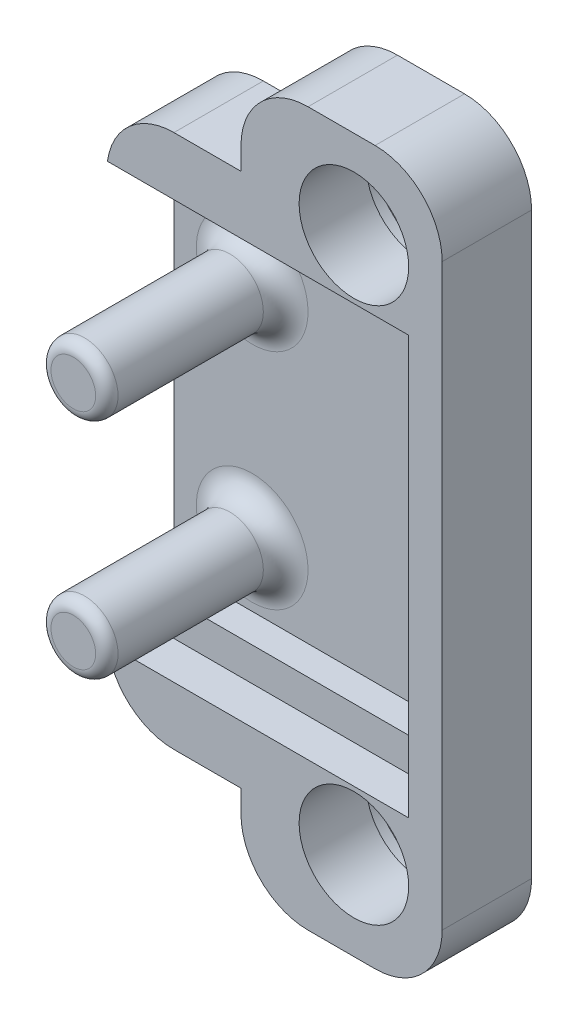
ISO-10303-21;
HEADER;
FILE_DESCRIPTION(('STEP AP214'),'2;1');
FILE_NAME('part.step','',(''),(''),'','','');
FILE_SCHEMA(('AUTOMOTIVE_DESIGN { 1 0 10303 214 1 1 1 1 }'));
ENDSEC;
DATA;
#1=APPLICATION_CONTEXT('core data for automotive mechanical design processes');
#2=APPLICATION_PROTOCOL_DEFINITION('international standard','automotive_design',2000,#1);
#3=PRODUCT_CONTEXT('',#1,'mechanical');
#4=PRODUCT('Part','Part','',(#3));
#5=PRODUCT_RELATED_PRODUCT_CATEGORY('part','',(#4));
#6=PRODUCT_DEFINITION_FORMATION('','',#4);
#7=PRODUCT_DEFINITION_CONTEXT('part definition',#1,'design');
#8=PRODUCT_DEFINITION('design','',#6,#7);
#9=PRODUCT_DEFINITION_SHAPE('','',#8);
#10=(LENGTH_UNIT() NAMED_UNIT(*) SI_UNIT(.MILLI.,.METRE.));
#11=(NAMED_UNIT(*) PLANE_ANGLE_UNIT() SI_UNIT($,.RADIAN.));
#12=(NAMED_UNIT(*) SI_UNIT($,.STERADIAN.) SOLID_ANGLE_UNIT());
#13=UNCERTAINTY_MEASURE_WITH_UNIT(LENGTH_MEASURE(1.E-05),#10,'distance_accuracy_value','');
#14=(GEOMETRIC_REPRESENTATION_CONTEXT(3) GLOBAL_UNCERTAINTY_ASSIGNED_CONTEXT((#13)) GLOBAL_UNIT_ASSIGNED_CONTEXT((#10,
#11,#12)) REPRESENTATION_CONTEXT('',''));
#15=CARTESIAN_POINT('',(0.,0.,0.));
#16=DIRECTION('',(0.,0.,1.));
#17=DIRECTION('',(1.,0.,0.));
#18=AXIS2_PLACEMENT_3D('',#15,#16,#17);
#19=CARTESIAN_POINT('',(6.29041095890411,-12.,4.));
#20=DIRECTION('',(0.,0.,-1.));
#21=DIRECTION('',(-1.,0.,0.));
#22=AXIS2_PLACEMENT_3D('',#19,#20,#21);
#23=CYLINDRICAL_SURFACE('',#22,2.45);
#24=CARTESIAN_POINT('',(6.29041095890411,-12.,4.));
#25=DIRECTION('',(0.,0.,1.));
#26=DIRECTION('',(1.,0.,0.));
#27=AXIS2_PLACEMENT_3D('',#24,#25,#26);
#28=CIRCLE('',#27,2.45);
#29=CARTESIAN_POINT('',(8.74041095890411,-12.,4.));
#30=VERTEX_POINT('',#29);
#31=EDGE_CURVE('E315',#30,#30,#28,.T.);
#32=ORIENTED_EDGE('',*,*,#31,.T.);
#33=EDGE_LOOP('',(#32));
#34=FACE_BOUND('',#33,.T.);
#35=CARTESIAN_POINT('',(6.29041095890411,-12.,1.));
#36=DIRECTION('',(0.,0.,-1.));
#37=DIRECTION('',(-1.,0.,0.));
#38=AXIS2_PLACEMENT_3D('',#35,#36,#37);
#39=CIRCLE('',#38,2.45);
#40=CARTESIAN_POINT('',(3.84041095890411,-12.,1.));
#41=VERTEX_POINT('',#40);
#42=EDGE_CURVE('E67',#41,#41,#39,.T.);
#43=ORIENTED_EDGE('',*,*,#42,.T.);
#44=EDGE_LOOP('',(#43));
#45=FACE_BOUND('',#44,.T.);
#46=ADVANCED_FACE('F63',(#34,#45),#23,.F.);
#47=CARTESIAN_POINT('',(6.29041095890411,12.,4.));
#48=DIRECTION('',(0.,0.,-1.));
#49=DIRECTION('',(-1.,0.,0.));
#50=AXIS2_PLACEMENT_3D('',#47,#48,#49);
#51=CYLINDRICAL_SURFACE('',#50,2.45);
#52=CARTESIAN_POINT('',(6.29041095890411,12.,4.));
#53=DIRECTION('',(0.,0.,1.));
#54=DIRECTION('',(1.,0.,0.));
#55=AXIS2_PLACEMENT_3D('',#52,#53,#54);
#56=CIRCLE('',#55,2.45);
#57=CARTESIAN_POINT('',(8.74041095890411,12.,4.));
#58=VERTEX_POINT('',#57);
#59=EDGE_CURVE('E312',#58,#58,#56,.T.);
#60=ORIENTED_EDGE('',*,*,#59,.T.);
#61=EDGE_LOOP('',(#60));
#62=FACE_BOUND('',#61,.T.);
#63=CARTESIAN_POINT('',(6.29041095890411,12.,1.));
#64=DIRECTION('',(0.,0.,-1.));
#65=DIRECTION('',(-1.,0.,0.));
#66=AXIS2_PLACEMENT_3D('',#63,#64,#65);
#67=CIRCLE('',#66,2.45);
#68=CARTESIAN_POINT('',(3.84041095890411,12.,1.));
#69=VERTEX_POINT('',#68);
#70=EDGE_CURVE('E413',#69,#69,#67,.T.);
#71=ORIENTED_EDGE('',*,*,#70,.T.);
#72=EDGE_LOOP('',(#71));
#73=FACE_BOUND('',#72,.T.);
#74=ADVANCED_FACE('F524',(#62,#73),#51,.F.);
#75=CARTESIAN_POINT('',(0.,0.,4.));
#76=DIRECTION('',(0.,0.,1.));
#77=DIRECTION('',(1.,0.,0.));
#78=AXIS2_PLACEMENT_3D('',#75,#76,#77);
#79=PLANE('',#78);
#80=ORIENTED_EDGE('',*,*,#59,.F.);
#81=EDGE_LOOP('',(#80));
#82=FACE_BOUND('',#81,.T.);
#83=ORIENTED_EDGE('',*,*,#31,.F.);
#84=EDGE_LOOP('',(#83));
#85=FACE_BOUND('',#84,.T.);
#86=DIRECTION('',(0.,-1.,0.));
#87=VECTOR('',#86,1.);
#88=CARTESIAN_POINT('',(10.2404109589041,0.,4.));
#89=LINE('',#88,#87);
#90=CARTESIAN_POINT('',(10.2404109589041,12.95,4.));
#91=VERTEX_POINT('',#90);
#92=CARTESIAN_POINT('',(10.2404109589041,-12.95,4.));
#93=VERTEX_POINT('',#92);
#94=EDGE_CURVE('E325',#91,#93,#89,.T.);
#95=ORIENTED_EDGE('',*,*,#94,.F.);
#96=CARTESIAN_POINT('',(7.24041095890411,12.95,4.));
#97=DIRECTION('',(0.,0.,1.));
#98=DIRECTION('',(1.,0.,0.));
#99=AXIS2_PLACEMENT_3D('',#96,#97,#98);
#100=CIRCLE('',#99,3.);
#101=CARTESIAN_POINT('',(7.24041095890411,15.95,4.));
#102=VERTEX_POINT('',#101);
#103=EDGE_CURVE('E369',#91,#102,#100,.T.);
#104=ORIENTED_EDGE('',*,*,#103,.T.);
#105=DIRECTION('',(1.,0.,0.));
#106=VECTOR('',#105,1.);
#107=CARTESIAN_POINT('',(0.,15.95,4.));
#108=LINE('',#107,#106);
#109=CARTESIAN_POINT('',(4.24041095890411,15.95,4.));
#110=VERTEX_POINT('',#109);
#111=EDGE_CURVE('E319',#110,#102,#108,.T.);
#112=ORIENTED_EDGE('',*,*,#111,.F.);
#113=CARTESIAN_POINT('',(4.24041095890411,12.95,4.));
#114=DIRECTION('',(0.,0.,1.));
#115=DIRECTION('',(1.,0.,0.));
#116=AXIS2_PLACEMENT_3D('',#113,#114,#115);
#117=CIRCLE('',#116,3.);
#118=CARTESIAN_POINT('',(1.24041095890411,12.95,4.));
#119=VERTEX_POINT('',#118);
#120=EDGE_CURVE('E233',#110,#119,#117,.T.);
#121=ORIENTED_EDGE('',*,*,#120,.T.);
#122=DIRECTION('',(0.,-1.,0.));
#123=VECTOR('',#122,1.);
#124=CARTESIAN_POINT('',(1.24041095890412,0.,4.));
#125=LINE('',#124,#123);
#126=CARTESIAN_POINT('',(1.24041095890411,11.95,4.));
#127=VERTEX_POINT('',#126);
#128=EDGE_CURVE('E227',#119,#127,#125,.T.);
#129=ORIENTED_EDGE('',*,*,#128,.T.);
#130=DIRECTION('',(1.,0.,0.));
#131=VECTOR('',#130,1.);
#132=CARTESIAN_POINT('',(0.,11.95,4.));
#133=LINE('',#132,#131);
#134=CARTESIAN_POINT('',(-1.75958904109589,11.95,4.));
#135=VERTEX_POINT('',#134);
#136=EDGE_CURVE('E217',#135,#127,#133,.T.);
#137=ORIENTED_EDGE('',*,*,#136,.F.);
#138=CARTESIAN_POINT('',(-1.75958904109589,8.95,4.));
#139=DIRECTION('',(0.,0.,1.));
#140=DIRECTION('',(1.,0.,0.));
#141=AXIS2_PLACEMENT_3D('',#138,#139,#140);
#142=CIRCLE('',#141,3.);
#143=CARTESIAN_POINT('',(-4.73280279055959,9.35,4.));
#144=VERTEX_POINT('',#143);
#145=EDGE_CURVE('E361',#135,#144,#142,.T.);
#146=ORIENTED_EDGE('',*,*,#145,.T.);
#147=DIRECTION('',(1.,0.,0.));
#148=VECTOR('',#147,1.);
#149=CARTESIAN_POINT('',(0.,9.35,4.));
#150=LINE('',#149,#148);
#151=CARTESIAN_POINT('',(8.74041095890411,9.35,4.));
#152=VERTEX_POINT('',#151);
#153=EDGE_CURVE('E295',#144,#152,#150,.T.);
#154=ORIENTED_EDGE('',*,*,#153,.T.);
#155=DIRECTION('',(0.,-1.,0.));
#156=VECTOR('',#155,1.);
#157=CARTESIAN_POINT('',(8.74041095890411,0.,4.));
#158=LINE('',#157,#156);
#159=CARTESIAN_POINT('',(8.74041095890411,-9.35,4.));
#160=VERTEX_POINT('',#159);
#161=EDGE_CURVE('E300',#152,#160,#158,.T.);
#162=ORIENTED_EDGE('',*,*,#161,.T.);
#163=DIRECTION('',(1.,0.,0.));
#164=VECTOR('',#163,1.);
#165=CARTESIAN_POINT('',(0.,-9.35,4.));
#166=LINE('',#165,#164);
#167=CARTESIAN_POINT('',(-4.73280279055959,-9.35,4.));
#168=VERTEX_POINT('',#167);
#169=EDGE_CURVE('E302',#168,#160,#166,.T.);
#170=ORIENTED_EDGE('',*,*,#169,.F.);
#171=CARTESIAN_POINT('',(-1.75958904109589,-8.95,4.));
#172=DIRECTION('',(0.,0.,1.));
#173=DIRECTION('',(1.,0.,0.));
#174=AXIS2_PLACEMENT_3D('',#171,#172,#173);
#175=CIRCLE('',#174,3.);
#176=CARTESIAN_POINT('',(-1.75958904109589,-11.95,4.));
#177=VERTEX_POINT('',#176);
#178=EDGE_CURVE('E363',#168,#177,#175,.T.);
#179=ORIENTED_EDGE('',*,*,#178,.T.);
#180=DIRECTION('',(1.,0.,0.));
#181=VECTOR('',#180,1.);
#182=CARTESIAN_POINT('',(0.,-11.95,4.));
#183=LINE('',#182,#181);
#184=CARTESIAN_POINT('',(1.24041095890411,-11.95,4.));
#185=VERTEX_POINT('',#184);
#186=EDGE_CURVE('E251',#177,#185,#183,.T.);
#187=ORIENTED_EDGE('',*,*,#186,.T.);
#188=DIRECTION('',(0.,1.,0.));
#189=VECTOR('',#188,1.);
#190=CARTESIAN_POINT('',(1.24041095890411,0.,4.));
#191=LINE('',#190,#189);
#192=CARTESIAN_POINT('',(1.24041095890411,-12.95,4.));
#193=VERTEX_POINT('',#192);
#194=EDGE_CURVE('E249',#193,#185,#191,.T.);
#195=ORIENTED_EDGE('',*,*,#194,.F.);
#196=CARTESIAN_POINT('',(4.24041095890411,-12.95,4.));
#197=DIRECTION('',(0.,0.,1.));
#198=DIRECTION('',(1.,0.,0.));
#199=AXIS2_PLACEMENT_3D('',#196,#197,#198);
#200=CIRCLE('',#199,3.);
#201=CARTESIAN_POINT('',(4.24041095890411,-15.95,4.));
#202=VERTEX_POINT('',#201);
#203=EDGE_CURVE('E365',#193,#202,#200,.T.);
#204=ORIENTED_EDGE('',*,*,#203,.T.);
#205=DIRECTION('',(1.,0.,0.));
#206=VECTOR('',#205,1.);
#207=CARTESIAN_POINT('',(0.,-15.95,4.));
#208=LINE('',#207,#206);
#209=CARTESIAN_POINT('',(7.24041095890411,-15.95,4.));
#210=VERTEX_POINT('',#209);
#211=EDGE_CURVE('E322',#202,#210,#208,.T.);
#212=ORIENTED_EDGE('',*,*,#211,.T.);
#213=CARTESIAN_POINT('',(7.24041095890411,-12.95,4.));
#214=DIRECTION('',(0.,0.,1.));
#215=DIRECTION('',(1.,0.,0.));
#216=AXIS2_PLACEMENT_3D('',#213,#214,#215);
#217=CIRCLE('',#216,3.);
#218=EDGE_CURVE('E367',#210,#93,#217,.T.);
#219=ORIENTED_EDGE('',*,*,#218,.T.);
#220=EDGE_LOOP('',(#95,#104,#112,#121,#129,#137,#146,#154,#162,#170,#179,#187,#195,#204,#212,#219));
#221=FACE_BOUND('',#220,.T.);
#222=ADVANCED_FACE('F231',(#82,#85,#221),#79,.T.);
#223=CARTESIAN_POINT('',(0.,15.95,4.));
#224=DIRECTION('',(0.,1.,0.));
#225=DIRECTION('',(0.,0.,1.));
#226=AXIS2_PLACEMENT_3D('',#223,#224,#225);
#227=PLANE('',#226);
#228=ORIENTED_EDGE('',*,*,#111,.T.);
#229=DIRECTION('',(0.,0.,-1.));
#230=VECTOR('',#229,1.);
#231=CARTESIAN_POINT('',(7.24041095890411,15.95,4.));
#232=LINE('',#231,#230);
#233=CARTESIAN_POINT('',(7.24041095890411,15.95,0.));
#234=VERTEX_POINT('',#233);
#235=EDGE_CURVE('E340',#102,#234,#232,.T.);
#236=ORIENTED_EDGE('',*,*,#235,.T.);
#237=DIRECTION('',(1.,0.,0.));
#238=VECTOR('',#237,1.);
#239=CARTESIAN_POINT('',(0.,15.95,0.));
#240=LINE('',#239,#238);
#241=CARTESIAN_POINT('',(4.24041095890411,15.95,0.));
#242=VERTEX_POINT('',#241);
#243=EDGE_CURVE('E309',#242,#234,#240,.T.);
#244=ORIENTED_EDGE('',*,*,#243,.F.);
#245=DIRECTION('',(0.,0.,1.));
#246=VECTOR('',#245,1.);
#247=CARTESIAN_POINT('',(4.24041095890411,15.95,4.));
#248=LINE('',#247,#246);
#249=EDGE_CURVE('E337',#242,#110,#248,.T.);
#250=ORIENTED_EDGE('',*,*,#249,.T.);
#251=EDGE_LOOP('',(#228,#236,#244,#250));
#252=FACE_BOUND('',#251,.T.);
#253=ADVANCED_FACE('F441',(#252),#227,.T.);
#254=CARTESIAN_POINT('',(0.,0.,0.));
#255=DIRECTION('',(0.,0.,1.));
#256=DIRECTION('',(1.,0.,0.));
#257=AXIS2_PLACEMENT_3D('',#254,#255,#256);
#258=PLANE('',#257);
#259=CARTESIAN_POINT('',(6.29041095890411,12.,0.));
#260=DIRECTION('',(0.,0.,-1.));
#261=DIRECTION('',(-1.,0.,0.));
#262=AXIS2_PLACEMENT_3D('',#259,#260,#261);
#263=CIRCLE('',#262,3.25);
#264=CARTESIAN_POINT('',(3.04041095890411,12.,0.));
#265=VERTEX_POINT('',#264);
#266=EDGE_CURVE('E420',#265,#265,#263,.T.);
#267=ORIENTED_EDGE('',*,*,#266,.F.);
#268=EDGE_LOOP('',(#267));
#269=FACE_BOUND('',#268,.T.);
#270=CARTESIAN_POINT('',(6.29041095890411,-12.,0.));
#271=DIRECTION('',(0.,0.,-1.));
#272=DIRECTION('',(-1.,0.,0.));
#273=AXIS2_PLACEMENT_3D('',#270,#271,#272);
#274=CIRCLE('',#273,3.25);
#275=CARTESIAN_POINT('',(3.04041095890411,-12.,0.));
#276=VERTEX_POINT('',#275);
#277=EDGE_CURVE('E425',#276,#276,#274,.T.);
#278=ORIENTED_EDGE('',*,*,#277,.F.);
#279=EDGE_LOOP('',(#278));
#280=FACE_BOUND('',#279,.T.);
#281=ORIENTED_EDGE('',*,*,#243,.T.);
#282=CARTESIAN_POINT('',(7.24041095890411,12.95,0.));
#283=DIRECTION('',(0.,0.,1.));
#284=DIRECTION('',(1.,0.,0.));
#285=AXIS2_PLACEMENT_3D('',#282,#283,#284);
#286=CIRCLE('',#285,3.);
#287=CARTESIAN_POINT('',(10.2404109589041,12.95,0.));
#288=VERTEX_POINT('',#287);
#289=EDGE_CURVE('E353',#234,#288,#286,.F.);
#290=ORIENTED_EDGE('',*,*,#289,.T.);
#291=DIRECTION('',(0.,-1.,0.));
#292=VECTOR('',#291,1.);
#293=CARTESIAN_POINT('',(10.2404109589041,0.,0.));
#294=LINE('',#293,#292);
#295=CARTESIAN_POINT('',(10.2404109589041,-12.95,0.));
#296=VERTEX_POINT('',#295);
#297=EDGE_CURVE('E316',#288,#296,#294,.T.);
#298=ORIENTED_EDGE('',*,*,#297,.T.);
#299=CARTESIAN_POINT('',(7.24041095890411,-12.95,0.));
#300=DIRECTION('',(0.,0.,1.));
#301=DIRECTION('',(1.,0.,0.));
#302=AXIS2_PLACEMENT_3D('',#299,#300,#301);
#303=CIRCLE('',#302,3.);
#304=CARTESIAN_POINT('',(7.24041095890411,-15.95,0.));
#305=VERTEX_POINT('',#304);
#306=EDGE_CURVE('E351',#296,#305,#303,.F.);
#307=ORIENTED_EDGE('',*,*,#306,.T.);
#308=DIRECTION('',(1.,0.,0.));
#309=VECTOR('',#308,1.);
#310=CARTESIAN_POINT('',(0.,-15.95,0.));
#311=LINE('',#310,#309);
#312=CARTESIAN_POINT('',(4.24041095890411,-15.95,0.));
#313=VERTEX_POINT('',#312);
#314=EDGE_CURVE('E331',#313,#305,#311,.T.);
#315=ORIENTED_EDGE('',*,*,#314,.F.);
#316=CARTESIAN_POINT('',(4.24041095890411,-12.95,0.));
#317=DIRECTION('',(0.,0.,1.));
#318=DIRECTION('',(1.,0.,0.));
#319=AXIS2_PLACEMENT_3D('',#316,#317,#318);
#320=CIRCLE('',#319,3.);
#321=CARTESIAN_POINT('',(1.24041095890411,-12.95,0.));
#322=VERTEX_POINT('',#321);
#323=EDGE_CURVE('E349',#313,#322,#320,.F.);
#324=ORIENTED_EDGE('',*,*,#323,.T.);
#325=DIRECTION('',(0.,-1.,0.));
#326=VECTOR('',#325,1.);
#327=CARTESIAN_POINT('',(1.24041095890411,0.,0.));
#328=LINE('',#327,#326);
#329=CARTESIAN_POINT('',(1.24041095890411,-11.95,0.));
#330=VERTEX_POINT('',#329);
#331=EDGE_CURVE('E236',#330,#322,#328,.T.);
#332=ORIENTED_EDGE('',*,*,#331,.F.);
#333=DIRECTION('',(-1.,0.,0.));
#334=VECTOR('',#333,1.);
#335=CARTESIAN_POINT('',(0.,-11.95,0.));
#336=LINE('',#335,#334);
#337=CARTESIAN_POINT('',(-1.75958904109589,-11.95,0.));
#338=VERTEX_POINT('',#337);
#339=EDGE_CURVE('E245',#330,#338,#336,.T.);
#340=ORIENTED_EDGE('',*,*,#339,.T.);
#341=CARTESIAN_POINT('',(-1.75958904109589,-8.95,0.));
#342=DIRECTION('',(0.,0.,1.));
#343=DIRECTION('',(1.,0.,0.));
#344=AXIS2_PLACEMENT_3D('',#341,#342,#343);
#345=CIRCLE('',#344,3.);
#346=CARTESIAN_POINT('',(-4.75958904109589,-8.95,0.));
#347=VERTEX_POINT('',#346);
#348=EDGE_CURVE('E347',#338,#347,#345,.F.);
#349=ORIENTED_EDGE('',*,*,#348,.T.);
#350=DIRECTION('',(0.,-1.,0.));
#351=VECTOR('',#350,1.);
#352=CARTESIAN_POINT('',(-4.75958904109589,0.,0.));
#353=LINE('',#352,#351);
#354=CARTESIAN_POINT('',(-4.75958904109589,8.95,0.));
#355=VERTEX_POINT('',#354);
#356=EDGE_CURVE('E268',#355,#347,#353,.T.);
#357=ORIENTED_EDGE('',*,*,#356,.F.);
#358=CARTESIAN_POINT('',(-1.75958904109589,8.95,0.));
#359=DIRECTION('',(0.,0.,1.));
#360=DIRECTION('',(1.,0.,0.));
#361=AXIS2_PLACEMENT_3D('',#358,#359,#360);
#362=CIRCLE('',#361,3.);
#363=CARTESIAN_POINT('',(-1.75958904109589,11.95,0.));
#364=VERTEX_POINT('',#363);
#365=EDGE_CURVE('E345',#355,#364,#362,.F.);
#366=ORIENTED_EDGE('',*,*,#365,.T.);
#367=DIRECTION('',(-1.,0.,0.));
#368=VECTOR('',#367,1.);
#369=CARTESIAN_POINT('',(0.,11.95,0.));
#370=LINE('',#369,#368);
#371=CARTESIAN_POINT('',(1.24041095890411,11.95,0.));
#372=VERTEX_POINT('',#371);
#373=EDGE_CURVE('E241',#372,#364,#370,.T.);
#374=ORIENTED_EDGE('',*,*,#373,.F.);
#375=DIRECTION('',(0.,1.,0.));
#376=VECTOR('',#375,1.);
#377=CARTESIAN_POINT('',(1.24041095890412,0.,0.));
#378=LINE('',#377,#376);
#379=CARTESIAN_POINT('',(1.24041095890411,12.95,0.));
#380=VERTEX_POINT('',#379);
#381=EDGE_CURVE('E240',#372,#380,#378,.T.);
#382=ORIENTED_EDGE('',*,*,#381,.T.);
#383=CARTESIAN_POINT('',(4.24041095890411,12.95,0.));
#384=DIRECTION('',(0.,0.,1.));
#385=DIRECTION('',(1.,0.,0.));
#386=AXIS2_PLACEMENT_3D('',#383,#384,#385);
#387=CIRCLE('',#386,3.);
#388=EDGE_CURVE('E343',#380,#242,#387,.F.);
#389=ORIENTED_EDGE('',*,*,#388,.T.);
#390=EDGE_LOOP('',(#281,#290,#298,#307,#315,#324,#332,#340,#349,#357,#366,#374,#382,#389));
#391=FACE_BOUND('',#390,.T.);
#392=ADVANCED_FACE('F435',(#269,#280,#391),#258,.F.);
#393=CARTESIAN_POINT('',(-4.75958904109589,0.,-3.4));
#394=DIRECTION('',(-1.,0.,0.));
#395=DIRECTION('',(0.,-1.,0.));
#396=AXIS2_PLACEMENT_3D('',#393,#394,#395);
#397=PLANE('',#396);
#398=ORIENTED_EDGE('',*,*,#356,.T.);
#399=DIRECTION('',(0.,0.,1.));
#400=VECTOR('',#399,1.);
#401=CARTESIAN_POINT('',(-4.75958904109589,-8.95,-3.4));
#402=LINE('',#401,#400);
#403=CARTESIAN_POINT('',(-4.75958904109589,-8.95,2.3));
#404=VERTEX_POINT('',#403);
#405=EDGE_CURVE('E380',#347,#404,#402,.T.);
#406=ORIENTED_EDGE('',*,*,#405,.T.);
#407=DIRECTION('',(0.,-1.,0.));
#408=VECTOR('',#407,1.);
#409=CARTESIAN_POINT('',(-4.75958904109589,0.,2.3));
#410=LINE('',#409,#408);
#411=CARTESIAN_POINT('',(-4.75958904109589,-7.85,2.3));
#412=VERTEX_POINT('',#411);
#413=EDGE_CURVE('E328',#412,#404,#410,.T.);
#414=ORIENTED_EDGE('',*,*,#413,.F.);
#415=DIRECTION('',(0.,0.,-1.));
#416=VECTOR('',#415,1.);
#417=CARTESIAN_POINT('',(-4.75958904109589,-7.85,2.3));
#418=LINE('',#417,#416);
#419=CARTESIAN_POINT('',(-4.75958904109589,-7.85,1.));
#420=VERTEX_POINT('',#419);
#421=EDGE_CURVE('E258',#412,#420,#418,.T.);
#422=ORIENTED_EDGE('',*,*,#421,.T.);
#423=DIRECTION('',(0.,-1.,0.));
#424=VECTOR('',#423,1.);
#425=CARTESIAN_POINT('',(-4.75958904109589,0.,1.));
#426=LINE('',#425,#424);
#427=CARTESIAN_POINT('',(-4.75958904109589,7.85,1.));
#428=VERTEX_POINT('',#427);
#429=EDGE_CURVE('E260',#428,#420,#426,.T.);
#430=ORIENTED_EDGE('',*,*,#429,.F.);
#431=DIRECTION('',(0.,0.,1.));
#432=VECTOR('',#431,1.);
#433=CARTESIAN_POINT('',(-4.75958904109589,7.85,2.3));
#434=LINE('',#433,#432);
#435=CARTESIAN_POINT('',(-4.75958904109589,7.85,2.3));
#436=VERTEX_POINT('',#435);
#437=EDGE_CURVE('E263',#428,#436,#434,.T.);
#438=ORIENTED_EDGE('',*,*,#437,.T.);
#439=DIRECTION('',(0.,1.,0.));
#440=VECTOR('',#439,1.);
#441=CARTESIAN_POINT('',(-4.75958904109589,0.,2.3));
#442=LINE('',#441,#440);
#443=CARTESIAN_POINT('',(-4.75958904109589,8.95,2.3));
#444=VERTEX_POINT('',#443);
#445=EDGE_CURVE('E265',#436,#444,#442,.T.);
#446=ORIENTED_EDGE('',*,*,#445,.T.);
#447=DIRECTION('',(0.,0.,1.));
#448=VECTOR('',#447,1.);
#449=CARTESIAN_POINT('',(-4.75958904109589,8.95,0.));
#450=LINE('',#449,#448);
#451=EDGE_CURVE('E378',#444,#355,#450,.F.);
#452=ORIENTED_EDGE('',*,*,#451,.T.);
#453=EDGE_LOOP('',(#398,#406,#414,#422,#430,#438,#446,#452));
#454=FACE_BOUND('',#453,.T.);
#455=ADVANCED_FACE('F481',(#454),#397,.T.);
#456=CARTESIAN_POINT('',(0.,0.,1.));
#457=DIRECTION('',(0.,0.,1.));
#458=DIRECTION('',(1.,0.,0.));
#459=AXIS2_PLACEMENT_3D('',#456,#457,#458);
#460=PLANE('',#459);
#461=CARTESIAN_POINT('',(-1.25958904109589,-5.,1.));
#462=DIRECTION('',(0.,0.,1.));
#463=DIRECTION('',(1.,0.,0.));
#464=AXIS2_PLACEMENT_3D('',#461,#462,#463);
#465=CIRCLE('',#464,2.5);
#466=CARTESIAN_POINT('',(1.24041095890411,-5.,1.));
#467=VERTEX_POINT('',#466);
#468=EDGE_CURVE('E400',#467,#467,#465,.F.);
#469=ORIENTED_EDGE('',*,*,#468,.T.);
#470=EDGE_LOOP('',(#469));
#471=FACE_BOUND('',#470,.T.);
#472=CARTESIAN_POINT('',(-1.25958904109589,5.,1.));
#473=DIRECTION('',(0.,0.,1.));
#474=DIRECTION('',(1.,0.,0.));
#475=AXIS2_PLACEMENT_3D('',#472,#473,#474);
#476=CIRCLE('',#475,2.5);
#477=CARTESIAN_POINT('',(1.24041095890411,5.,1.));
#478=VERTEX_POINT('',#477);
#479=EDGE_CURVE('E397',#478,#478,#476,.F.);
#480=ORIENTED_EDGE('',*,*,#479,.T.);
#481=EDGE_LOOP('',(#480));
#482=FACE_BOUND('',#481,.T.);
#483=DIRECTION('',(1.,0.,0.));
#484=VECTOR('',#483,1.);
#485=CARTESIAN_POINT('',(8.74041095890411,7.85,1.));
#486=LINE('',#485,#484);
#487=CARTESIAN_POINT('',(8.74041095890411,7.85,1.));
#488=VERTEX_POINT('',#487);
#489=EDGE_CURVE('E277',#428,#488,#486,.T.);
#490=ORIENTED_EDGE('',*,*,#489,.F.);
#491=ORIENTED_EDGE('',*,*,#429,.T.);
#492=DIRECTION('',(-1.,0.,0.));
#493=VECTOR('',#492,1.);
#494=CARTESIAN_POINT('',(8.74041095890411,-7.85,1.));
#495=LINE('',#494,#493);
#496=CARTESIAN_POINT('',(8.74041095890411,-7.85,1.));
#497=VERTEX_POINT('',#496);
#498=EDGE_CURVE('E274',#497,#420,#495,.T.);
#499=ORIENTED_EDGE('',*,*,#498,.F.);
#500=DIRECTION('',(0.,-1.,0.));
#501=VECTOR('',#500,1.);
#502=CARTESIAN_POINT('',(8.74041095890411,0.,1.));
#503=LINE('',#502,#501);
#504=EDGE_CURVE('E296',#488,#497,#503,.T.);
#505=ORIENTED_EDGE('',*,*,#504,.F.);
#506=EDGE_LOOP('',(#490,#491,#499,#505));
#507=FACE_BOUND('',#506,.T.);
#508=ADVANCED_FACE('F492',(#471,#482,#507),#460,.T.);
#509=CARTESIAN_POINT('',(0.,9.35,1.));
#510=DIRECTION('',(0.,-1.,0.));
#511=DIRECTION('',(0.,0.,-1.));
#512=AXIS2_PLACEMENT_3D('',#509,#510,#511);
#513=PLANE('',#512);
#514=ORIENTED_EDGE('',*,*,#153,.F.);
#515=DIRECTION('',(0.,0.,-1.));
#516=VECTOR('',#515,1.);
#517=CARTESIAN_POINT('',(-4.73280279055959,9.35,4.));
#518=LINE('',#517,#516);
#519=CARTESIAN_POINT('',(-4.73280279055959,9.35,2.3));
#520=VERTEX_POINT('',#519);
#521=EDGE_CURVE('E80',#144,#520,#518,.T.);
#522=ORIENTED_EDGE('',*,*,#521,.T.);
#523=DIRECTION('',(-1.,0.,0.));
#524=VECTOR('',#523,1.);
#525=CARTESIAN_POINT('',(8.74041095890411,9.35,2.3));
#526=LINE('',#525,#524);
#527=CARTESIAN_POINT('',(8.74041095890411,9.35,2.3));
#528=VERTEX_POINT('',#527);
#529=EDGE_CURVE('E287',#528,#520,#526,.T.);
#530=ORIENTED_EDGE('',*,*,#529,.F.);
#531=DIRECTION('',(0.,0.,1.));
#532=VECTOR('',#531,1.);
#533=CARTESIAN_POINT('',(8.74041095890411,9.35,1.));
#534=LINE('',#533,#532);
#535=EDGE_CURVE('E306',#528,#152,#534,.T.);
#536=ORIENTED_EDGE('',*,*,#535,.T.);
#537=EDGE_LOOP('',(#514,#522,#530,#536));
#538=FACE_BOUND('',#537,.T.);
#539=ADVANCED_FACE('F507',(#538),#513,.T.);
#540=CARTESIAN_POINT('',(0.,-15.95,4.));
#541=DIRECTION('',(0.,1.,0.));
#542=DIRECTION('',(0.,0.,1.));
#543=AXIS2_PLACEMENT_3D('',#540,#541,#542);
#544=PLANE('',#543);
#545=ORIENTED_EDGE('',*,*,#314,.T.);
#546=DIRECTION('',(0.,0.,-1.));
#547=VECTOR('',#546,1.);
#548=CARTESIAN_POINT('',(7.24041095890411,-15.95,4.));
#549=LINE('',#548,#547);
#550=EDGE_CURVE('E373',#305,#210,#549,.F.);
#551=ORIENTED_EDGE('',*,*,#550,.T.);
#552=ORIENTED_EDGE('',*,*,#211,.F.);
#553=DIRECTION('',(0.,0.,1.));
#554=VECTOR('',#553,1.);
#555=CARTESIAN_POINT('',(4.24041095890411,-15.95,4.));
#556=LINE('',#555,#554);
#557=EDGE_CURVE('E371',#202,#313,#556,.F.);
#558=ORIENTED_EDGE('',*,*,#557,.T.);
#559=EDGE_LOOP('',(#545,#551,#552,#558));
#560=FACE_BOUND('',#559,.T.);
#561=ADVANCED_FACE('F458',(#560),#544,.F.);
#562=CARTESIAN_POINT('',(0.,-9.35,1.));
#563=DIRECTION('',(0.,-1.,0.));
#564=DIRECTION('',(0.,0.,-1.));
#565=AXIS2_PLACEMENT_3D('',#562,#563,#564);
#566=PLANE('',#565);
#567=DIRECTION('',(1.,0.,0.));
#568=VECTOR('',#567,1.);
#569=CARTESIAN_POINT('',(8.74041095890411,-9.35,2.3));
#570=LINE('',#569,#568);
#571=CARTESIAN_POINT('',(-4.73280279055959,-9.35,2.3));
#572=VERTEX_POINT('',#571);
#573=CARTESIAN_POINT('',(8.74041095890411,-9.35,2.3));
#574=VERTEX_POINT('',#573);
#575=EDGE_CURVE('E273',#572,#574,#570,.T.);
#576=ORIENTED_EDGE('',*,*,#575,.F.);
#577=DIRECTION('',(0.,0.,1.));
#578=VECTOR('',#577,1.);
#579=CARTESIAN_POINT('',(-4.73280279055959,-9.35,2.3));
#580=LINE('',#579,#578);
#581=EDGE_CURVE('E384',#572,#168,#580,.T.);
#582=ORIENTED_EDGE('',*,*,#581,.T.);
#583=ORIENTED_EDGE('',*,*,#169,.T.);
#584=DIRECTION('',(0.,0.,1.));
#585=VECTOR('',#584,1.);
#586=CARTESIAN_POINT('',(8.74041095890411,-9.35,1.));
#587=LINE('',#586,#585);
#588=EDGE_CURVE('E299',#574,#160,#587,.T.);
#589=ORIENTED_EDGE('',*,*,#588,.F.);
#590=EDGE_LOOP('',(#576,#582,#583,#589));
#591=FACE_BOUND('',#590,.T.);
#592=ADVANCED_FACE('F838',(#591),#566,.F.);
#593=CARTESIAN_POINT('',(8.74041095890411,7.85,2.3));
#594=DIRECTION('',(0.,1.,0.));
#595=DIRECTION('',(-1.,0.,0.));
#596=AXIS2_PLACEMENT_3D('',#593,#594,#595);
#597=PLANE('',#596);
#598=ORIENTED_EDGE('',*,*,#437,.F.);
#599=ORIENTED_EDGE('',*,*,#489,.T.);
#600=DIRECTION('',(0.,0.,-1.));
#601=VECTOR('',#600,1.);
#602=CARTESIAN_POINT('',(8.74041095890411,7.85,2.3));
#603=LINE('',#602,#601);
#604=CARTESIAN_POINT('',(8.74041095890411,7.85,2.3));
#605=VERTEX_POINT('',#604);
#606=EDGE_CURVE('E291',#605,#488,#603,.T.);
#607=ORIENTED_EDGE('',*,*,#606,.F.);
#608=DIRECTION('',(1.,0.,0.));
#609=VECTOR('',#608,1.);
#610=CARTESIAN_POINT('',(8.74041095890411,7.85,2.3));
#611=LINE('',#610,#609);
#612=EDGE_CURVE('E289',#436,#605,#611,.T.);
#613=ORIENTED_EDGE('',*,*,#612,.F.);
#614=EDGE_LOOP('',(#598,#599,#607,#613));
#615=FACE_BOUND('',#614,.T.);
#616=ADVANCED_FACE('F496',(#615),#597,.F.);
#617=CARTESIAN_POINT('',(0.,0.,2.3));
#618=DIRECTION('',(0.,0.,-1.));
#619=DIRECTION('',(-1.,0.,0.));
#620=AXIS2_PLACEMENT_3D('',#617,#618,#619);
#621=PLANE('',#620);
#622=ORIENTED_EDGE('',*,*,#529,.T.);
#623=CARTESIAN_POINT('',(-1.75958904109589,8.95,2.3));
#624=DIRECTION('',(0.,0.,-1.));
#625=DIRECTION('',(-1.,0.,0.));
#626=AXIS2_PLACEMENT_3D('',#623,#624,#625);
#627=CIRCLE('',#626,3.);
#628=EDGE_CURVE('E390',#520,#444,#627,.F.);
#629=ORIENTED_EDGE('',*,*,#628,.T.);
#630=ORIENTED_EDGE('',*,*,#445,.F.);
#631=ORIENTED_EDGE('',*,*,#612,.T.);
#632=DIRECTION('',(0.,1.,0.));
#633=VECTOR('',#632,1.);
#634=CARTESIAN_POINT('',(8.74041095890411,9.35,2.3));
#635=LINE('',#634,#633);
#636=EDGE_CURVE('E285',#605,#528,#635,.T.);
#637=ORIENTED_EDGE('',*,*,#636,.T.);
#638=EDGE_LOOP('',(#622,#629,#630,#631,#637));
#639=FACE_BOUND('',#638,.T.);
#640=ADVANCED_FACE('F504',(#639),#621,.F.);
#641=CARTESIAN_POINT('',(8.74041095890411,-7.85,2.3));
#642=DIRECTION('',(0.,-1.,0.));
#643=DIRECTION('',(1.,0.,0.));
#644=AXIS2_PLACEMENT_3D('',#641,#642,#643);
#645=PLANE('',#644);
#646=ORIENTED_EDGE('',*,*,#421,.F.);
#647=DIRECTION('',(-1.,0.,0.));
#648=VECTOR('',#647,1.);
#649=CARTESIAN_POINT('',(8.74041095890411,-7.85,2.3));
#650=LINE('',#649,#648);
#651=CARTESIAN_POINT('',(8.74041095890411,-7.85,2.3));
#652=VERTEX_POINT('',#651);
#653=EDGE_CURVE('E280',#652,#412,#650,.T.);
#654=ORIENTED_EDGE('',*,*,#653,.F.);
#655=DIRECTION('',(0.,0.,-1.));
#656=VECTOR('',#655,1.);
#657=CARTESIAN_POINT('',(8.74041095890411,-7.85,2.3));
#658=LINE('',#657,#656);
#659=EDGE_CURVE('E271',#652,#497,#658,.T.);
#660=ORIENTED_EDGE('',*,*,#659,.T.);
#661=ORIENTED_EDGE('',*,*,#498,.T.);
#662=EDGE_LOOP('',(#646,#654,#660,#661));
#663=FACE_BOUND('',#662,.T.);
#664=ADVANCED_FACE('F487',(#663),#645,.F.);
#665=CARTESIAN_POINT('',(0.,0.,2.3));
#666=DIRECTION('',(0.,0.,1.));
#667=DIRECTION('',(1.,0.,0.));
#668=AXIS2_PLACEMENT_3D('',#665,#666,#667);
#669=PLANE('',#668);
#670=ORIENTED_EDGE('',*,*,#413,.T.);
#671=CARTESIAN_POINT('',(-1.75958904109589,-8.95,2.3));
#672=DIRECTION('',(0.,0.,1.));
#673=DIRECTION('',(1.,0.,0.));
#674=AXIS2_PLACEMENT_3D('',#671,#672,#673);
#675=CIRCLE('',#674,3.);
#676=EDGE_CURVE('E88',#404,#572,#675,.T.);
#677=ORIENTED_EDGE('',*,*,#676,.T.);
#678=ORIENTED_EDGE('',*,*,#575,.T.);
#679=DIRECTION('',(0.,1.,0.));
#680=VECTOR('',#679,1.);
#681=CARTESIAN_POINT('',(8.74041095890411,-9.35,2.3));
#682=LINE('',#681,#680);
#683=EDGE_CURVE('E278',#574,#652,#682,.T.);
#684=ORIENTED_EDGE('',*,*,#683,.T.);
#685=ORIENTED_EDGE('',*,*,#653,.T.);
#686=EDGE_LOOP('',(#670,#677,#678,#684,#685));
#687=FACE_BOUND('',#686,.T.);
#688=ADVANCED_FACE('F483',(#687),#669,.T.);
#689=CARTESIAN_POINT('',(8.74041095890411,0.,1.));
#690=DIRECTION('',(-1.,0.,0.));
#691=DIRECTION('',(0.,-1.,0.));
#692=AXIS2_PLACEMENT_3D('',#689,#690,#691);
#693=PLANE('',#692);
#694=ORIENTED_EDGE('',*,*,#504,.T.);
#695=ORIENTED_EDGE('',*,*,#659,.F.);
#696=ORIENTED_EDGE('',*,*,#683,.F.);
#697=ORIENTED_EDGE('',*,*,#588,.T.);
#698=ORIENTED_EDGE('',*,*,#161,.F.);
#699=ORIENTED_EDGE('',*,*,#535,.F.);
#700=ORIENTED_EDGE('',*,*,#636,.F.);
#701=ORIENTED_EDGE('',*,*,#606,.T.);
#702=EDGE_LOOP('',(#694,#695,#696,#697,#698,#699,#700,#701));
#703=FACE_BOUND('',#702,.T.);
#704=ADVANCED_FACE('F500',(#703),#693,.T.);
#705=CARTESIAN_POINT('',(10.2404109589041,0.,4.));
#706=DIRECTION('',(1.,0.,0.));
#707=DIRECTION('',(0.,1.,0.));
#708=AXIS2_PLACEMENT_3D('',#705,#706,#707);
#709=PLANE('',#708);
#710=ORIENTED_EDGE('',*,*,#297,.F.);
#711=DIRECTION('',(0.,0.,-1.));
#712=VECTOR('',#711,1.);
#713=CARTESIAN_POINT('',(10.2404109589041,12.95,4.));
#714=LINE('',#713,#712);
#715=EDGE_CURVE('E358',#288,#91,#714,.F.);
#716=ORIENTED_EDGE('',*,*,#715,.T.);
#717=ORIENTED_EDGE('',*,*,#94,.T.);
#718=DIRECTION('',(0.,0.,-1.));
#719=VECTOR('',#718,1.);
#720=CARTESIAN_POINT('',(10.2404109589041,-12.95,0.));
#721=LINE('',#720,#719);
#722=EDGE_CURVE('E355',#93,#296,#721,.T.);
#723=ORIENTED_EDGE('',*,*,#722,.T.);
#724=EDGE_LOOP('',(#710,#716,#717,#723));
#725=FACE_BOUND('',#724,.T.);
#726=ADVANCED_FACE('F449',(#725),#709,.T.);
#727=CARTESIAN_POINT('',(-1.25958904109589,5.,9.));
#728=DIRECTION('',(0.,0.,-1.));
#729=DIRECTION('',(-1.,0.,0.));
#730=AXIS2_PLACEMENT_3D('',#727,#728,#729);
#731=CYLINDRICAL_SURFACE('',#730,1.5);
#732=CARTESIAN_POINT('',(-1.25958904109589,5.,8.5));
#733=DIRECTION('',(0.,0.,1.));
#734=DIRECTION('',(1.,0.,0.));
#735=AXIS2_PLACEMENT_3D('',#732,#733,#734);
#736=CIRCLE('',#735,1.5);
#737=CARTESIAN_POINT('',(0.240410958904109,5.,8.5));
#738=VERTEX_POINT('',#737);
#739=EDGE_CURVE('E12',#738,#738,#736,.F.);
#740=ORIENTED_EDGE('',*,*,#739,.T.);
#741=EDGE_LOOP('',(#740));
#742=FACE_BOUND('',#741,.T.);
#743=CARTESIAN_POINT('',(-1.25958904109589,5.,2.));
#744=DIRECTION('',(0.,0.,1.));
#745=DIRECTION('',(1.,0.,0.));
#746=AXIS2_PLACEMENT_3D('',#743,#744,#745);
#747=CIRCLE('',#746,1.5);
#748=CARTESIAN_POINT('',(0.240410958904109,5.,2.));
#749=VERTEX_POINT('',#748);
#750=EDGE_CURVE('E403',#749,#749,#747,.T.);
#751=ORIENTED_EDGE('',*,*,#750,.T.);
#752=EDGE_LOOP('',(#751));
#753=FACE_BOUND('',#752,.T.);
#754=ADVANCED_FACE('F605',(#742,#753),#731,.T.);
#755=CARTESIAN_POINT('',(0.,0.,9.));
#756=DIRECTION('',(0.,0.,1.));
#757=DIRECTION('',(1.,0.,0.));
#758=AXIS2_PLACEMENT_3D('',#755,#756,#757);
#759=PLANE('',#758);
#760=CARTESIAN_POINT('',(-1.25958904109589,5.,9.));
#761=DIRECTION('',(0.,0.,1.));
#762=DIRECTION('',(1.,0.,0.));
#763=AXIS2_PLACEMENT_3D('',#760,#761,#762);
#764=CIRCLE('',#763,1.);
#765=CARTESIAN_POINT('',(-0.259589041095891,5.,9.));
#766=VERTEX_POINT('',#765);
#767=EDGE_CURVE('E72',#766,#766,#764,.T.);
#768=ORIENTED_EDGE('',*,*,#767,.T.);
#769=EDGE_LOOP('',(#768));
#770=FACE_BOUND('',#769,.T.);
#771=ADVANCED_FACE('F610',(#770),#759,.T.);
#772=CARTESIAN_POINT('',(-1.25958904109589,-5.,9.));
#773=DIRECTION('',(0.,0.,-1.));
#774=DIRECTION('',(-1.,0.,0.));
#775=AXIS2_PLACEMENT_3D('',#772,#773,#774);
#776=CYLINDRICAL_SURFACE('',#775,1.5);
#777=CARTESIAN_POINT('',(-1.25958904109589,-5.,8.5));
#778=DIRECTION('',(0.,0.,1.));
#779=DIRECTION('',(1.,0.,0.));
#780=AXIS2_PLACEMENT_3D('',#777,#778,#779);
#781=CIRCLE('',#780,1.5);
#782=CARTESIAN_POINT('',(0.240410958904111,-5.,8.5));
#783=VERTEX_POINT('',#782);
#784=EDGE_CURVE('E409',#783,#783,#781,.F.);
#785=ORIENTED_EDGE('',*,*,#784,.T.);
#786=EDGE_LOOP('',(#785));
#787=FACE_BOUND('',#786,.T.);
#788=CARTESIAN_POINT('',(-1.25958904109589,-5.,2.));
#789=DIRECTION('',(0.,0.,1.));
#790=DIRECTION('',(1.,0.,0.));
#791=AXIS2_PLACEMENT_3D('',#788,#789,#790);
#792=CIRCLE('',#791,1.5);
#793=CARTESIAN_POINT('',(0.240410958904111,-5.,2.));
#794=VERTEX_POINT('',#793);
#795=EDGE_CURVE('E394',#794,#794,#792,.T.);
#796=ORIENTED_EDGE('',*,*,#795,.T.);
#797=EDGE_LOOP('',(#796));
#798=FACE_BOUND('',#797,.T.);
#799=ADVANCED_FACE('F623',(#787,#798),#776,.T.);
#800=CARTESIAN_POINT('',(0.,0.,9.));
#801=DIRECTION('',(0.,0.,1.));
#802=DIRECTION('',(1.,0.,0.));
#803=AXIS2_PLACEMENT_3D('',#800,#801,#802);
#804=PLANE('',#803);
#805=CARTESIAN_POINT('',(-1.25958904109589,-5.,9.));
#806=DIRECTION('',(0.,0.,1.));
#807=DIRECTION('',(1.,0.,0.));
#808=AXIS2_PLACEMENT_3D('',#805,#806,#807);
#809=CIRCLE('',#808,1.);
#810=CARTESIAN_POINT('',(-0.259589041095889,-5.,9.));
#811=VERTEX_POINT('',#810);
#812=EDGE_CURVE('E406',#811,#811,#809,.T.);
#813=ORIENTED_EDGE('',*,*,#812,.T.);
#814=EDGE_LOOP('',(#813));
#815=FACE_BOUND('',#814,.T.);
#816=ADVANCED_FACE('F634',(#815),#804,.T.);
#817=CARTESIAN_POINT('',(0.,-11.95,-7.21110255092798));
#818=DIRECTION('',(0.,-1.,0.));
#819=DIRECTION('',(0.,0.,-1.));
#820=AXIS2_PLACEMENT_3D('',#817,#818,#819);
#821=PLANE('',#820);
#822=ORIENTED_EDGE('',*,*,#186,.F.);
#823=DIRECTION('',(0.,0.,1.));
#824=VECTOR('',#823,1.);
#825=CARTESIAN_POINT('',(-1.75958904109589,-11.95,-7.21110255092798));
#826=LINE('',#825,#824);
#827=EDGE_CURVE('E386',#177,#338,#826,.F.);
#828=ORIENTED_EDGE('',*,*,#827,.T.);
#829=ORIENTED_EDGE('',*,*,#339,.F.);
#830=DIRECTION('',(0.,0.,1.));
#831=VECTOR('',#830,1.);
#832=CARTESIAN_POINT('',(1.24041095890411,-11.95,-7.21110255092798));
#833=LINE('',#832,#831);
#834=EDGE_CURVE('E248',#330,#185,#833,.T.);
#835=ORIENTED_EDGE('',*,*,#834,.T.);
#836=EDGE_LOOP('',(#822,#828,#829,#835));
#837=FACE_BOUND('',#836,.T.);
#838=ADVANCED_FACE('F471',(#837),#821,.T.);
#839=CARTESIAN_POINT('',(1.24041095890411,0.,-7.21110255092798));
#840=DIRECTION('',(1.,0.,0.));
#841=DIRECTION('',(0.,0.,-1.));
#842=AXIS2_PLACEMENT_3D('',#839,#840,#841);
#843=PLANE('',#842);
#844=ORIENTED_EDGE('',*,*,#331,.T.);
#845=DIRECTION('',(0.,0.,1.));
#846=VECTOR('',#845,1.);
#847=CARTESIAN_POINT('',(1.24041095890411,-12.95,-7.21110255092798));
#848=LINE('',#847,#846);
#849=EDGE_CURVE('E375',#322,#193,#848,.T.);
#850=ORIENTED_EDGE('',*,*,#849,.T.);
#851=ORIENTED_EDGE('',*,*,#194,.T.);
#852=ORIENTED_EDGE('',*,*,#834,.F.);
#853=EDGE_LOOP('',(#844,#850,#851,#852));
#854=FACE_BOUND('',#853,.T.);
#855=ADVANCED_FACE('F467',(#854),#843,.F.);
#856=CARTESIAN_POINT('',(1.24041095890412,0.,-7.21110255092798));
#857=DIRECTION('',(-1.,0.,0.));
#858=DIRECTION('',(0.,-1.,0.));
#859=AXIS2_PLACEMENT_3D('',#856,#857,#858);
#860=PLANE('',#859);
#861=ORIENTED_EDGE('',*,*,#128,.F.);
#862=DIRECTION('',(0.,0.,1.));
#863=VECTOR('',#862,1.);
#864=CARTESIAN_POINT('',(1.24041095890411,12.95,-7.21110255092798));
#865=LINE('',#864,#863);
#866=EDGE_CURVE('E392',#119,#380,#865,.F.);
#867=ORIENTED_EDGE('',*,*,#866,.T.);
#868=ORIENTED_EDGE('',*,*,#381,.F.);
#869=DIRECTION('',(0.,0.,1.));
#870=VECTOR('',#869,1.);
#871=CARTESIAN_POINT('',(1.24041095890411,11.95,-7.21110255092798));
#872=LINE('',#871,#870);
#873=EDGE_CURVE('E222',#372,#127,#872,.T.);
#874=ORIENTED_EDGE('',*,*,#873,.T.);
#875=EDGE_LOOP('',(#861,#867,#868,#874));
#876=FACE_BOUND('',#875,.T.);
#877=ADVANCED_FACE('F238',(#876),#860,.T.);
#878=CARTESIAN_POINT('',(0.,11.95,-7.21110255092798));
#879=DIRECTION('',(0.,-1.,0.));
#880=DIRECTION('',(0.,0.,-1.));
#881=AXIS2_PLACEMENT_3D('',#878,#879,#880);
#882=PLANE('',#881);
#883=ORIENTED_EDGE('',*,*,#373,.T.);
#884=DIRECTION('',(0.,0.,1.));
#885=VECTOR('',#884,1.);
#886=CARTESIAN_POINT('',(-1.75958904109589,11.95,4.));
#887=LINE('',#886,#885);
#888=EDGE_CURVE('E225',#364,#135,#887,.T.);
#889=ORIENTED_EDGE('',*,*,#888,.T.);
#890=ORIENTED_EDGE('',*,*,#136,.T.);
#891=ORIENTED_EDGE('',*,*,#873,.F.);
#892=EDGE_LOOP('',(#883,#889,#890,#891));
#893=FACE_BOUND('',#892,.T.);
#894=ADVANCED_FACE('F220',(#893),#882,.F.);
#895=CARTESIAN_POINT('',(7.24041095890411,12.95,4.));
#896=DIRECTION('',(0.,0.,-1.));
#897=DIRECTION('',(-1.,0.,0.));
#898=AXIS2_PLACEMENT_3D('',#895,#896,#897);
#899=CYLINDRICAL_SURFACE('',#898,3.);
#900=ORIENTED_EDGE('',*,*,#103,.F.);
#901=ORIENTED_EDGE('',*,*,#715,.F.);
#902=ORIENTED_EDGE('',*,*,#289,.F.);
#903=ORIENTED_EDGE('',*,*,#235,.F.);
#904=EDGE_LOOP('',(#900,#901,#902,#903));
#905=FACE_BOUND('',#904,.T.);
#906=ADVANCED_FACE('F446',(#905),#899,.T.);
#907=CARTESIAN_POINT('',(7.24041095890411,-12.95,4.));
#908=DIRECTION('',(0.,0.,1.));
#909=DIRECTION('',(1.,0.,0.));
#910=AXIS2_PLACEMENT_3D('',#907,#908,#909);
#911=CYLINDRICAL_SURFACE('',#910,3.);
#912=ORIENTED_EDGE('',*,*,#218,.F.);
#913=ORIENTED_EDGE('',*,*,#550,.F.);
#914=ORIENTED_EDGE('',*,*,#306,.F.);
#915=ORIENTED_EDGE('',*,*,#722,.F.);
#916=EDGE_LOOP('',(#912,#913,#914,#915));
#917=FACE_BOUND('',#916,.T.);
#918=ADVANCED_FACE('F453',(#917),#911,.T.);
#919=CARTESIAN_POINT('',(4.24041095890411,-12.95,-7.21110255092798));
#920=DIRECTION('',(0.,0.,1.));
#921=DIRECTION('',(1.,0.,0.));
#922=AXIS2_PLACEMENT_3D('',#919,#920,#921);
#923=CYLINDRICAL_SURFACE('',#922,3.);
#924=ORIENTED_EDGE('',*,*,#323,.F.);
#925=ORIENTED_EDGE('',*,*,#557,.F.);
#926=ORIENTED_EDGE('',*,*,#203,.F.);
#927=ORIENTED_EDGE('',*,*,#849,.F.);
#928=EDGE_LOOP('',(#924,#925,#926,#927));
#929=FACE_BOUND('',#928,.T.);
#930=ADVANCED_FACE('F462',(#929),#923,.T.);
#931=CARTESIAN_POINT('',(-1.75958904109589,-8.95,-3.4));
#932=DIRECTION('',(0.,0.,1.));
#933=DIRECTION('',(1.,0.,0.));
#934=AXIS2_PLACEMENT_3D('',#931,#932,#933);
#935=CYLINDRICAL_SURFACE('',#934,3.);
#936=ORIENTED_EDGE('',*,*,#348,.F.);
#937=ORIENTED_EDGE('',*,*,#827,.F.);
#938=ORIENTED_EDGE('',*,*,#178,.F.);
#939=ORIENTED_EDGE('',*,*,#581,.F.);
#940=ORIENTED_EDGE('',*,*,#676,.F.);
#941=ORIENTED_EDGE('',*,*,#405,.F.);
#942=EDGE_LOOP('',(#936,#937,#938,#939,#940,#941));
#943=FACE_BOUND('',#942,.T.);
#944=ADVANCED_FACE('F477',(#943),#935,.T.);
#945=CARTESIAN_POINT('',(-1.75958904109589,8.95,-7.21110255092798));
#946=DIRECTION('',(0.,0.,-1.));
#947=DIRECTION('',(-1.,0.,0.));
#948=AXIS2_PLACEMENT_3D('',#945,#946,#947);
#949=CYLINDRICAL_SURFACE('',#948,3.);
#950=ORIENTED_EDGE('',*,*,#365,.F.);
#951=ORIENTED_EDGE('',*,*,#451,.F.);
#952=ORIENTED_EDGE('',*,*,#628,.F.);
#953=ORIENTED_EDGE('',*,*,#521,.F.);
#954=ORIENTED_EDGE('',*,*,#145,.F.);
#955=ORIENTED_EDGE('',*,*,#888,.F.);
#956=EDGE_LOOP('',(#950,#951,#952,#953,#954,#955));
#957=FACE_BOUND('',#956,.T.);
#958=ADVANCED_FACE('F512',(#957),#949,.T.);
#959=CARTESIAN_POINT('',(4.24041095890411,12.95,4.));
#960=DIRECTION('',(0.,0.,1.));
#961=DIRECTION('',(1.,0.,0.));
#962=AXIS2_PLACEMENT_3D('',#959,#960,#961);
#963=CYLINDRICAL_SURFACE('',#962,3.);
#964=ORIENTED_EDGE('',*,*,#388,.F.);
#965=ORIENTED_EDGE('',*,*,#866,.F.);
#966=ORIENTED_EDGE('',*,*,#120,.F.);
#967=ORIENTED_EDGE('',*,*,#249,.F.);
#968=EDGE_LOOP('',(#964,#965,#966,#967));
#969=FACE_BOUND('',#968,.T.);
#970=ADVANCED_FACE('F439',(#969),#963,.T.);
#971=CARTESIAN_POINT('',(-1.25958904109589,-5.,2.));
#972=DIRECTION('',(0.,0.,1.));
#973=DIRECTION('',(1.,0.,0.));
#974=AXIS2_PLACEMENT_3D('',#971,#972,#973);
#975=TOROIDAL_SURFACE('',#974,2.5,1.);
#976=ORIENTED_EDGE('',*,*,#468,.F.);
#977=EDGE_LOOP('',(#976));
#978=FACE_BOUND('',#977,.T.);
#979=ORIENTED_EDGE('',*,*,#795,.F.);
#980=EDGE_LOOP('',(#979));
#981=FACE_BOUND('',#980,.T.);
#982=ADVANCED_FACE('F520',(#978,#981),#975,.F.);
#983=CARTESIAN_POINT('',(-1.25958904109589,5.,2.));
#984=DIRECTION('',(0.,0.,1.));
#985=DIRECTION('',(1.,0.,0.));
#986=AXIS2_PLACEMENT_3D('',#983,#984,#985);
#987=TOROIDAL_SURFACE('',#986,2.5,1.);
#988=ORIENTED_EDGE('',*,*,#479,.F.);
#989=EDGE_LOOP('',(#988));
#990=FACE_BOUND('',#989,.T.);
#991=ORIENTED_EDGE('',*,*,#750,.F.);
#992=EDGE_LOOP('',(#991));
#993=FACE_BOUND('',#992,.T.);
#994=ADVANCED_FACE('F585',(#990,#993),#987,.F.);
#995=CARTESIAN_POINT('',(-1.25958904109589,-5.,8.5));
#996=DIRECTION('',(0.,0.,1.));
#997=DIRECTION('',(1.,0.,0.));
#998=AXIS2_PLACEMENT_3D('',#995,#996,#997);
#999=TOROIDAL_SURFACE('',#998,1.,0.5);
#1000=ORIENTED_EDGE('',*,*,#784,.F.);
#1001=EDGE_LOOP('',(#1000));
#1002=FACE_BOUND('',#1001,.T.);
#1003=ORIENTED_EDGE('',*,*,#812,.F.);
#1004=EDGE_LOOP('',(#1003));
#1005=FACE_BOUND('',#1004,.T.);
#1006=ADVANCED_FACE('F596',(#1002,#1005),#999,.T.);
#1007=CARTESIAN_POINT('',(-1.25958904109589,5.,8.5));
#1008=DIRECTION('',(0.,0.,1.));
#1009=DIRECTION('',(1.,0.,0.));
#1010=AXIS2_PLACEMENT_3D('',#1007,#1008,#1009);
#1011=TOROIDAL_SURFACE('',#1010,1.,0.5);
#1012=ORIENTED_EDGE('',*,*,#739,.F.);
#1013=EDGE_LOOP('',(#1012));
#1014=FACE_BOUND('',#1013,.T.);
#1015=ORIENTED_EDGE('',*,*,#767,.F.);
#1016=EDGE_LOOP('',(#1015));
#1017=FACE_BOUND('',#1016,.T.);
#1018=ADVANCED_FACE('F65',(#1014,#1017),#1011,.T.);
#1019=CARTESIAN_POINT('',(6.29041095890411,12.,1.));
#1020=DIRECTION('',(0.,0.,-1.));
#1021=DIRECTION('',(-1.,0.,0.));
#1022=AXIS2_PLACEMENT_3D('',#1019,#1020,#1021);
#1023=CYLINDRICAL_SURFACE('',#1022,3.25);
#1024=CARTESIAN_POINT('',(6.29041095890411,12.,1.));
#1025=DIRECTION('',(0.,0.,-1.));
#1026=DIRECTION('',(-1.,0.,0.));
#1027=AXIS2_PLACEMENT_3D('',#1024,#1025,#1026);
#1028=CIRCLE('',#1027,3.25);
#1029=CARTESIAN_POINT('',(3.04041095890411,12.,1.));
#1030=VERTEX_POINT('',#1029);
#1031=EDGE_CURVE('E415',#1030,#1030,#1028,.T.);
#1032=ORIENTED_EDGE('',*,*,#1031,.F.);
#1033=EDGE_LOOP('',(#1032));
#1034=FACE_BOUND('',#1033,.T.);
#1035=ORIENTED_EDGE('',*,*,#266,.T.);
#1036=EDGE_LOOP('',(#1035));
#1037=FACE_BOUND('',#1036,.T.);
#1038=ADVANCED_FACE('F662',(#1034,#1037),#1023,.F.);
#1039=CARTESIAN_POINT('',(6.29041095890411,12.,1.));
#1040=DIRECTION('',(0.,0.,-1.));
#1041=DIRECTION('',(-1.,0.,0.));
#1042=AXIS2_PLACEMENT_3D('',#1039,#1040,#1041);
#1043=PLANE('',#1042);
#1044=ORIENTED_EDGE('',*,*,#70,.F.);
#1045=EDGE_LOOP('',(#1044));
#1046=FACE_BOUND('',#1045,.T.);
#1047=ORIENTED_EDGE('',*,*,#1031,.T.);
#1048=EDGE_LOOP('',(#1047));
#1049=FACE_BOUND('',#1048,.T.);
#1050=ADVANCED_FACE('F684',(#1046,#1049),#1043,.T.);
#1051=CARTESIAN_POINT('',(6.29041095890411,-12.,1.));
#1052=DIRECTION('',(0.,0.,-1.));
#1053=DIRECTION('',(-1.,0.,0.));
#1054=AXIS2_PLACEMENT_3D('',#1051,#1052,#1053);
#1055=CYLINDRICAL_SURFACE('',#1054,3.25);
#1056=CARTESIAN_POINT('',(6.29041095890411,-12.,1.));
#1057=DIRECTION('',(0.,0.,-1.));
#1058=DIRECTION('',(-1.,0.,0.));
#1059=AXIS2_PLACEMENT_3D('',#1056,#1057,#1058);
#1060=CIRCLE('',#1059,3.25);
#1061=CARTESIAN_POINT('',(3.04041095890411,-12.,1.));
#1062=VERTEX_POINT('',#1061);
#1063=EDGE_CURVE('E430',#1062,#1062,#1060,.T.);
#1064=ORIENTED_EDGE('',*,*,#1063,.F.);
#1065=EDGE_LOOP('',(#1064));
#1066=FACE_BOUND('',#1065,.T.);
#1067=ORIENTED_EDGE('',*,*,#277,.T.);
#1068=EDGE_LOOP('',(#1067));
#1069=FACE_BOUND('',#1068,.T.);
#1070=ADVANCED_FACE('F692',(#1066,#1069),#1055,.F.);
#1071=CARTESIAN_POINT('',(6.29041095890411,-12.,1.));
#1072=DIRECTION('',(0.,0.,-1.));
#1073=DIRECTION('',(-1.,0.,0.));
#1074=AXIS2_PLACEMENT_3D('',#1071,#1072,#1073);
#1075=PLANE('',#1074);
#1076=ORIENTED_EDGE('',*,*,#42,.F.);
#1077=EDGE_LOOP('',(#1076));
#1078=FACE_BOUND('',#1077,.T.);
#1079=ORIENTED_EDGE('',*,*,#1063,.T.);
#1080=EDGE_LOOP('',(#1079));
#1081=FACE_BOUND('',#1080,.T.);
#1082=ADVANCED_FACE('F700',(#1078,#1081),#1075,.T.);
#1083=CLOSED_SHELL('',(#46,#74,#222,#253,#392,#455,#508,#539,#561,#592,#616,#640,#664,#688,#704,
#726,#754,#771,#799,#816,#838,#855,#877,#894,#906,#918,#930,#944,#958,#970,#982,#994,#1006,
#1018,#1038,#1050,#1070,#1082));
#1084=MANIFOLD_SOLID_BREP('B2',#1083);
#1085=ADVANCED_BREP_SHAPE_REPRESENTATION('',(#18,#1084),#14);
#1086=SHAPE_DEFINITION_REPRESENTATION(#9,#1085);
ENDSEC;
END-ISO-10303-21;
